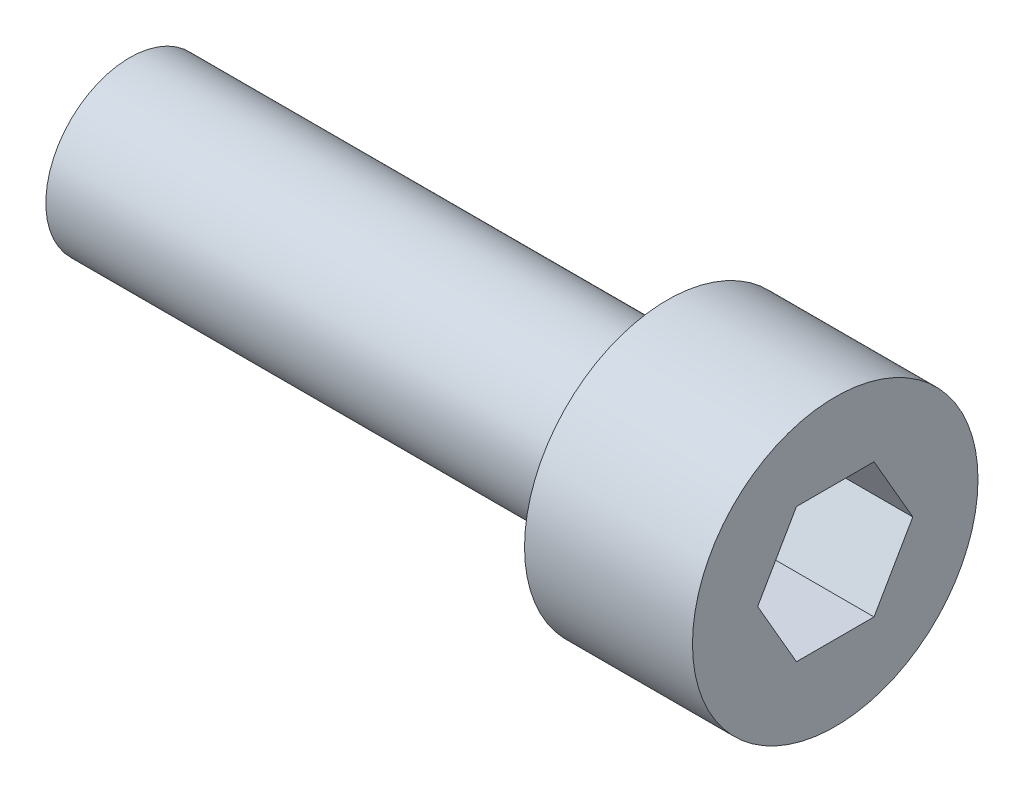
ISO-10303-21;
HEADER;
FILE_DESCRIPTION(('STEP AP214'),'2;1');
FILE_NAME('part.step','',(''),(''),'','','');
FILE_SCHEMA(('AUTOMOTIVE_DESIGN { 1 0 10303 214 1 1 1 1 }'));
ENDSEC;
DATA;
#1=APPLICATION_CONTEXT('core data for automotive mechanical design processes');
#2=APPLICATION_PROTOCOL_DEFINITION('international standard','automotive_design',2000,#1);
#3=PRODUCT_CONTEXT('',#1,'mechanical');
#4=PRODUCT('Part','Part','',(#3));
#5=PRODUCT_RELATED_PRODUCT_CATEGORY('part','',(#4));
#6=PRODUCT_DEFINITION_FORMATION('','',#4);
#7=PRODUCT_DEFINITION_CONTEXT('part definition',#1,'design');
#8=PRODUCT_DEFINITION('design','',#6,#7);
#9=PRODUCT_DEFINITION_SHAPE('','',#8);
#10=(LENGTH_UNIT() NAMED_UNIT(*) SI_UNIT(.MILLI.,.METRE.));
#11=(NAMED_UNIT(*) PLANE_ANGLE_UNIT() SI_UNIT($,.RADIAN.));
#12=(NAMED_UNIT(*) SI_UNIT($,.STERADIAN.) SOLID_ANGLE_UNIT());
#13=UNCERTAINTY_MEASURE_WITH_UNIT(LENGTH_MEASURE(1.E-05),#10,'distance_accuracy_value','');
#14=(GEOMETRIC_REPRESENTATION_CONTEXT(3) GLOBAL_UNCERTAINTY_ASSIGNED_CONTEXT((#13)) GLOBAL_UNIT_ASSIGNED_CONTEXT((#10,
#11,#12)) REPRESENTATION_CONTEXT('',''));
#15=CARTESIAN_POINT('',(0.,0.,0.));
#16=DIRECTION('',(0.,0.,1.));
#17=DIRECTION('',(1.,0.,0.));
#18=AXIS2_PLACEMENT_3D('',#15,#16,#17);
#19=CARTESIAN_POINT('',(16.,0.,0.));
#20=DIRECTION('',(-1.,0.,0.));
#21=DIRECTION('',(0.,0.,1.));
#22=AXIS2_PLACEMENT_3D('',#19,#20,#21);
#23=CYLINDRICAL_SURFACE('',#22,2.5);
#24=CARTESIAN_POINT('',(16.,0.,0.));
#25=DIRECTION('',(1.,0.,0.));
#26=DIRECTION('',(0.,0.,-1.));
#27=AXIS2_PLACEMENT_3D('',#24,#25,#26);
#28=CIRCLE('',#27,2.5);
#29=CARTESIAN_POINT('',(16.,0.,-2.5));
#30=VERTEX_POINT('',#29);
#31=EDGE_CURVE('E11',#30,#30,#28,.T.);
#32=ORIENTED_EDGE('',*,*,#31,.F.);
#33=EDGE_LOOP('',(#32));
#34=FACE_BOUND('',#33,.T.);
#35=CARTESIAN_POINT('',(0.,0.,0.));
#36=DIRECTION('',(1.,0.,0.));
#37=DIRECTION('',(0.,0.,-1.));
#38=AXIS2_PLACEMENT_3D('',#35,#36,#37);
#39=CIRCLE('',#38,2.5);
#40=CARTESIAN_POINT('',(0.,0.,-2.5));
#41=VERTEX_POINT('',#40);
#42=EDGE_CURVE('E37',#41,#41,#39,.T.);
#43=ORIENTED_EDGE('',*,*,#42,.T.);
#44=EDGE_LOOP('',(#43));
#45=FACE_BOUND('',#44,.T.);
#46=ADVANCED_FACE('F34',(#34,#45),#23,.T.);
#47=CARTESIAN_POINT('',(0.,0.,0.));
#48=DIRECTION('',(1.,0.,0.));
#49=DIRECTION('',(0.,0.,-1.));
#50=AXIS2_PLACEMENT_3D('',#47,#48,#49);
#51=PLANE('',#50);
#52=ORIENTED_EDGE('',*,*,#42,.F.);
#53=EDGE_LOOP('',(#52));
#54=FACE_BOUND('',#53,.T.);
#55=ADVANCED_FACE('F165',(#54),#51,.F.);
#56=CARTESIAN_POINT('',(21.,0.,0.));
#57=DIRECTION('',(-1.,0.,0.));
#58=DIRECTION('',(0.,0.,1.));
#59=AXIS2_PLACEMENT_3D('',#56,#57,#58);
#60=CYLINDRICAL_SURFACE('',#59,4.25);
#61=CARTESIAN_POINT('',(21.,0.,0.));
#62=DIRECTION('',(1.,0.,0.));
#63=DIRECTION('',(0.,0.,-1.));
#64=AXIS2_PLACEMENT_3D('',#61,#62,#63);
#65=CIRCLE('',#64,4.25);
#66=CARTESIAN_POINT('',(21.,0.,-4.25));
#67=VERTEX_POINT('',#66);
#68=EDGE_CURVE('E141',#67,#67,#65,.T.);
#69=ORIENTED_EDGE('',*,*,#68,.F.);
#70=EDGE_LOOP('',(#69));
#71=FACE_BOUND('',#70,.T.);
#72=CARTESIAN_POINT('',(16.,0.,0.));
#73=DIRECTION('',(1.,0.,0.));
#74=DIRECTION('',(0.,0.,-1.));
#75=AXIS2_PLACEMENT_3D('',#72,#73,#74);
#76=CIRCLE('',#75,4.25);
#77=CARTESIAN_POINT('',(16.,0.,-4.25));
#78=VERTEX_POINT('',#77);
#79=EDGE_CURVE('E135',#78,#78,#76,.T.);
#80=ORIENTED_EDGE('',*,*,#79,.T.);
#81=EDGE_LOOP('',(#80));
#82=FACE_BOUND('',#81,.T.);
#83=ADVANCED_FACE('F147',(#71,#82),#60,.T.);
#84=CARTESIAN_POINT('',(21.,0.,0.));
#85=DIRECTION('',(1.,0.,0.));
#86=DIRECTION('',(0.,0.,-1.));
#87=AXIS2_PLACEMENT_3D('',#84,#85,#86);
#88=PLANE('',#87);
#89=DIRECTION('',(0.,0.866025403784439,-0.5));
#90=VECTOR('',#89,1.);
#91=CARTESIAN_POINT('',(21.,-2.,-1.15470053837925));
#92=LINE('',#91,#90);
#93=CARTESIAN_POINT('',(21.,-2.,-1.15470053837925));
#94=VERTEX_POINT('',#93);
#95=CARTESIAN_POINT('',(21.,0.,-2.3094010767585));
#96=VERTEX_POINT('',#95);
#97=EDGE_CURVE('E48',#94,#96,#92,.T.);
#98=ORIENTED_EDGE('',*,*,#97,.F.);
#99=DIRECTION('',(0.,0.,-1.));
#100=VECTOR('',#99,1.);
#101=CARTESIAN_POINT('',(21.,-2.,1.15470053837925));
#102=LINE('',#101,#100);
#103=CARTESIAN_POINT('',(21.,-2.,1.15470053837925));
#104=VERTEX_POINT('',#103);
#105=EDGE_CURVE('E131',#104,#94,#102,.T.);
#106=ORIENTED_EDGE('',*,*,#105,.F.);
#107=DIRECTION('',(0.,-0.866025403784439,-0.5));
#108=VECTOR('',#107,1.);
#109=CARTESIAN_POINT('',(21.,0.,2.3094010767585));
#110=LINE('',#109,#108);
#111=CARTESIAN_POINT('',(21.,0.,2.3094010767585));
#112=VERTEX_POINT('',#111);
#113=EDGE_CURVE('E129',#112,#104,#110,.T.);
#114=ORIENTED_EDGE('',*,*,#113,.F.);
#115=DIRECTION('',(0.,-0.866025403784439,0.5));
#116=VECTOR('',#115,1.);
#117=CARTESIAN_POINT('',(21.,2.,1.15470053837925));
#118=LINE('',#117,#116);
#119=CARTESIAN_POINT('',(21.,2.,1.15470053837925));
#120=VERTEX_POINT('',#119);
#121=EDGE_CURVE('E96',#120,#112,#118,.T.);
#122=ORIENTED_EDGE('',*,*,#121,.F.);
#123=DIRECTION('',(0.,0.,1.));
#124=VECTOR('',#123,1.);
#125=CARTESIAN_POINT('',(21.,2.,-1.15470053837925));
#126=LINE('',#125,#124);
#127=CARTESIAN_POINT('',(21.,2.,-1.15470053837925));
#128=VERTEX_POINT('',#127);
#129=EDGE_CURVE('E125',#128,#120,#126,.T.);
#130=ORIENTED_EDGE('',*,*,#129,.F.);
#131=DIRECTION('',(0.,0.866025403784439,0.5));
#132=VECTOR('',#131,1.);
#133=CARTESIAN_POINT('',(21.,0.,-2.3094010767585));
#134=LINE('',#133,#132);
#135=EDGE_CURVE('E122',#96,#128,#134,.T.);
#136=ORIENTED_EDGE('',*,*,#135,.F.);
#137=EDGE_LOOP('',(#98,#106,#114,#122,#130,#136));
#138=FACE_BOUND('',#137,.T.);
#139=ORIENTED_EDGE('',*,*,#68,.T.);
#140=EDGE_LOOP('',(#139));
#141=FACE_BOUND('',#140,.T.);
#142=ADVANCED_FACE('F152',(#138,#141),#88,.T.);
#143=CARTESIAN_POINT('',(16.,0.,0.));
#144=DIRECTION('',(1.,0.,0.));
#145=DIRECTION('',(0.,0.,-1.));
#146=AXIS2_PLACEMENT_3D('',#143,#144,#145);
#147=PLANE('',#146);
#148=ORIENTED_EDGE('',*,*,#31,.T.);
#149=EDGE_LOOP('',(#148));
#150=FACE_BOUND('',#149,.T.);
#151=ORIENTED_EDGE('',*,*,#79,.F.);
#152=EDGE_LOOP('',(#151));
#153=FACE_BOUND('',#152,.T.);
#154=ADVANCED_FACE('F149',(#150,#153),#147,.F.);
#155=CARTESIAN_POINT('',(17.5,-2.,-1.15470053837925));
#156=DIRECTION('',(0.,-0.5,-0.866025403784439));
#157=DIRECTION('',(0.,0.866025403784439,-0.5));
#158=AXIS2_PLACEMENT_3D('',#155,#156,#157);
#159=PLANE('',#158);
#160=ORIENTED_EDGE('',*,*,#97,.T.);
#161=DIRECTION('',(1.,0.,0.));
#162=VECTOR('',#161,1.);
#163=CARTESIAN_POINT('',(17.5,0.,-2.3094010767585));
#164=LINE('',#163,#162);
#165=CARTESIAN_POINT('',(17.5,0.,-2.3094010767585));
#166=VERTEX_POINT('',#165);
#167=EDGE_CURVE('E78',#166,#96,#164,.T.);
#168=ORIENTED_EDGE('',*,*,#167,.F.);
#169=DIRECTION('',(0.,0.866025403784439,-0.5));
#170=VECTOR('',#169,1.);
#171=CARTESIAN_POINT('',(17.5,-2.,-1.15470053837925));
#172=LINE('',#171,#170);
#173=CARTESIAN_POINT('',(17.5,-2.,-1.15470053837925));
#174=VERTEX_POINT('',#173);
#175=EDGE_CURVE('E133',#174,#166,#172,.T.);
#176=ORIENTED_EDGE('',*,*,#175,.F.);
#177=DIRECTION('',(1.,0.,0.));
#178=VECTOR('',#177,1.);
#179=CARTESIAN_POINT('',(17.5,-2.,-1.15470053837925));
#180=LINE('',#179,#178);
#181=EDGE_CURVE('E56',#174,#94,#180,.T.);
#182=ORIENTED_EDGE('',*,*,#181,.T.);
#183=EDGE_LOOP('',(#160,#168,#176,#182));
#184=FACE_BOUND('',#183,.T.);
#185=ADVANCED_FACE('F151',(#184),#159,.F.);
#186=CARTESIAN_POINT('',(17.5,-2.,1.15470053837925));
#187=DIRECTION('',(0.,-1.,0.));
#188=DIRECTION('',(0.,0.,-1.));
#189=AXIS2_PLACEMENT_3D('',#186,#187,#188);
#190=PLANE('',#189);
#191=ORIENTED_EDGE('',*,*,#105,.T.);
#192=ORIENTED_EDGE('',*,*,#181,.F.);
#193=DIRECTION('',(0.,0.,-1.));
#194=VECTOR('',#193,1.);
#195=CARTESIAN_POINT('',(17.5,-2.,1.15470053837925));
#196=LINE('',#195,#194);
#197=CARTESIAN_POINT('',(17.5,-2.,1.15470053837925));
#198=VERTEX_POINT('',#197);
#199=EDGE_CURVE('E108',#198,#174,#196,.T.);
#200=ORIENTED_EDGE('',*,*,#199,.F.);
#201=DIRECTION('',(1.,0.,0.));
#202=VECTOR('',#201,1.);
#203=CARTESIAN_POINT('',(17.5,-2.,1.15470053837925));
#204=LINE('',#203,#202);
#205=EDGE_CURVE('E100',#198,#104,#204,.T.);
#206=ORIENTED_EDGE('',*,*,#205,.T.);
#207=EDGE_LOOP('',(#191,#192,#200,#206));
#208=FACE_BOUND('',#207,.T.);
#209=ADVANCED_FACE('F159',(#208),#190,.F.);
#210=CARTESIAN_POINT('',(17.5,0.,2.3094010767585));
#211=DIRECTION('',(0.,-0.5,0.866025403784439));
#212=DIRECTION('',(0.,-0.866025403784439,-0.5));
#213=AXIS2_PLACEMENT_3D('',#210,#211,#212);
#214=PLANE('',#213);
#215=ORIENTED_EDGE('',*,*,#113,.T.);
#216=ORIENTED_EDGE('',*,*,#205,.F.);
#217=DIRECTION('',(0.,-0.866025403784439,-0.5));
#218=VECTOR('',#217,1.);
#219=CARTESIAN_POINT('',(17.5,0.,2.3094010767585));
#220=LINE('',#219,#218);
#221=CARTESIAN_POINT('',(17.5,0.,2.3094010767585));
#222=VERTEX_POINT('',#221);
#223=EDGE_CURVE('E104',#222,#198,#220,.T.);
#224=ORIENTED_EDGE('',*,*,#223,.F.);
#225=DIRECTION('',(1.,0.,0.));
#226=VECTOR('',#225,1.);
#227=CARTESIAN_POINT('',(17.5,0.,2.3094010767585));
#228=LINE('',#227,#226);
#229=EDGE_CURVE('E89',#222,#112,#228,.T.);
#230=ORIENTED_EDGE('',*,*,#229,.T.);
#231=EDGE_LOOP('',(#215,#216,#224,#230));
#232=FACE_BOUND('',#231,.T.);
#233=ADVANCED_FACE('F105',(#232),#214,.F.);
#234=CARTESIAN_POINT('',(17.5,2.,1.15470053837925));
#235=DIRECTION('',(0.,0.5,0.866025403784439));
#236=DIRECTION('',(0.,-0.866025403784439,0.5));
#237=AXIS2_PLACEMENT_3D('',#234,#235,#236);
#238=PLANE('',#237);
#239=ORIENTED_EDGE('',*,*,#121,.T.);
#240=ORIENTED_EDGE('',*,*,#229,.F.);
#241=DIRECTION('',(0.,-0.866025403784439,0.5));
#242=VECTOR('',#241,1.);
#243=CARTESIAN_POINT('',(17.5,2.,1.15470053837925));
#244=LINE('',#243,#242);
#245=CARTESIAN_POINT('',(17.5,2.,1.15470053837925));
#246=VERTEX_POINT('',#245);
#247=EDGE_CURVE('E93',#246,#222,#244,.T.);
#248=ORIENTED_EDGE('',*,*,#247,.F.);
#249=DIRECTION('',(1.,0.,0.));
#250=VECTOR('',#249,1.);
#251=CARTESIAN_POINT('',(17.5,2.,1.15470053837925));
#252=LINE('',#251,#250);
#253=EDGE_CURVE('E101',#246,#120,#252,.T.);
#254=ORIENTED_EDGE('',*,*,#253,.T.);
#255=EDGE_LOOP('',(#239,#240,#248,#254));
#256=FACE_BOUND('',#255,.T.);
#257=ADVANCED_FACE('F91',(#256),#238,.F.);
#258=CARTESIAN_POINT('',(17.5,2.,-1.15470053837925));
#259=DIRECTION('',(0.,1.,0.));
#260=DIRECTION('',(0.,0.,1.));
#261=AXIS2_PLACEMENT_3D('',#258,#259,#260);
#262=PLANE('',#261);
#263=ORIENTED_EDGE('',*,*,#129,.T.);
#264=ORIENTED_EDGE('',*,*,#253,.F.);
#265=DIRECTION('',(0.,0.,1.));
#266=VECTOR('',#265,1.);
#267=CARTESIAN_POINT('',(17.5,2.,-1.15470053837925));
#268=LINE('',#267,#266);
#269=CARTESIAN_POINT('',(17.5,2.,-1.15470053837925));
#270=VERTEX_POINT('',#269);
#271=EDGE_CURVE('E114',#270,#246,#268,.T.);
#272=ORIENTED_EDGE('',*,*,#271,.F.);
#273=DIRECTION('',(1.,0.,0.));
#274=VECTOR('',#273,1.);
#275=CARTESIAN_POINT('',(17.5,2.,-1.15470053837925));
#276=LINE('',#275,#274);
#277=EDGE_CURVE('E138',#270,#128,#276,.T.);
#278=ORIENTED_EDGE('',*,*,#277,.T.);
#279=EDGE_LOOP('',(#263,#264,#272,#278));
#280=FACE_BOUND('',#279,.T.);
#281=ADVANCED_FACE('F220',(#280),#262,.F.);
#282=CARTESIAN_POINT('',(17.5,0.,-2.3094010767585));
#283=DIRECTION('',(0.,0.5,-0.866025403784439));
#284=DIRECTION('',(0.,0.866025403784439,0.5));
#285=AXIS2_PLACEMENT_3D('',#282,#283,#284);
#286=PLANE('',#285);
#287=ORIENTED_EDGE('',*,*,#135,.T.);
#288=ORIENTED_EDGE('',*,*,#277,.F.);
#289=DIRECTION('',(0.,0.866025403784439,0.5));
#290=VECTOR('',#289,1.);
#291=CARTESIAN_POINT('',(17.5,0.,-2.3094010767585));
#292=LINE('',#291,#290);
#293=EDGE_CURVE('E116',#166,#270,#292,.T.);
#294=ORIENTED_EDGE('',*,*,#293,.F.);
#295=ORIENTED_EDGE('',*,*,#167,.T.);
#296=EDGE_LOOP('',(#287,#288,#294,#295));
#297=FACE_BOUND('',#296,.T.);
#298=ADVANCED_FACE('F229',(#297),#286,.F.);
#299=CARTESIAN_POINT('',(17.5,0.,0.));
#300=DIRECTION('',(1.,0.,0.));
#301=DIRECTION('',(0.,0.,-1.));
#302=AXIS2_PLACEMENT_3D('',#299,#300,#301);
#303=PLANE('',#302);
#304=ORIENTED_EDGE('',*,*,#175,.T.);
#305=ORIENTED_EDGE('',*,*,#293,.T.);
#306=ORIENTED_EDGE('',*,*,#271,.T.);
#307=ORIENTED_EDGE('',*,*,#247,.T.);
#308=ORIENTED_EDGE('',*,*,#223,.T.);
#309=ORIENTED_EDGE('',*,*,#199,.T.);
#310=EDGE_LOOP('',(#304,#305,#306,#307,#308,#309));
#311=FACE_BOUND('',#310,.T.);
#312=ADVANCED_FACE('F111',(#311),#303,.T.);
#313=CLOSED_SHELL('',(#46,#55,#83,#142,#154,#185,#209,#233,#257,#281,#298,#312));
#314=MANIFOLD_SOLID_BREP('B2',#313);
#315=ADVANCED_BREP_SHAPE_REPRESENTATION('',(#18,#314),#14);
#316=SHAPE_DEFINITION_REPRESENTATION(#9,#315);
ENDSEC;
END-ISO-10303-21;
